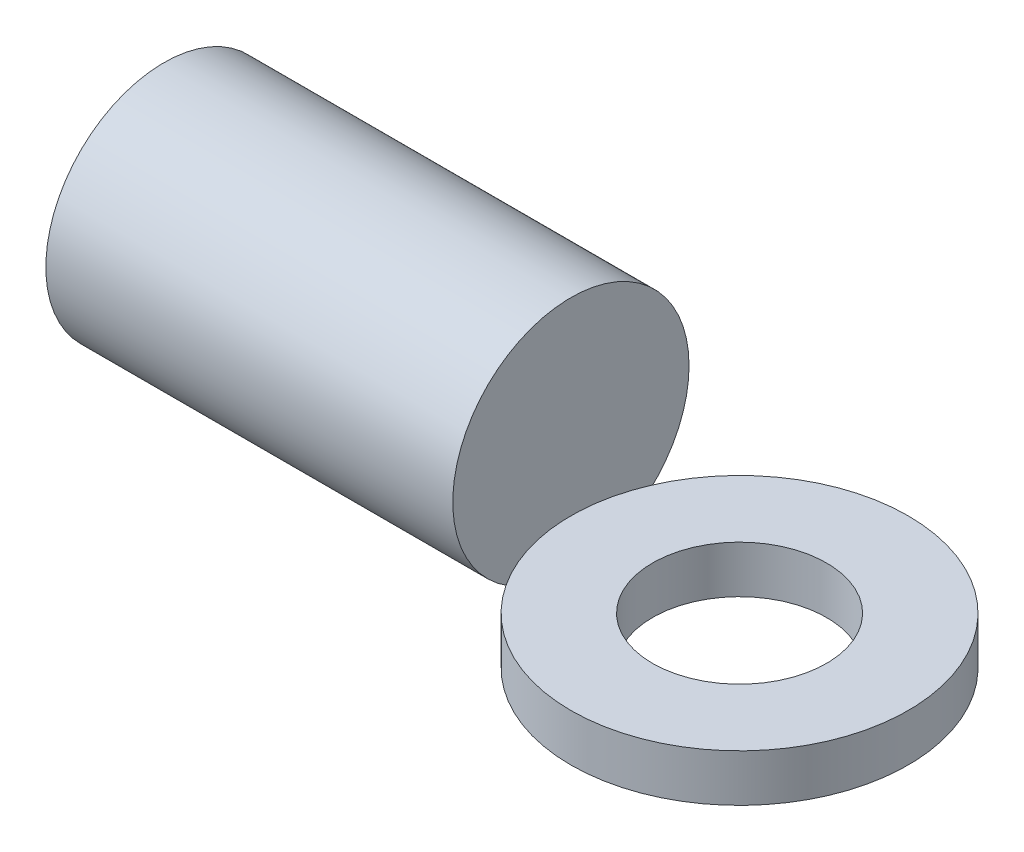
ISO-10303-21;
HEADER;
FILE_DESCRIPTION(('STEP AP214'),'2;1');
FILE_NAME('part.step','',(''),(''),'','','');
FILE_SCHEMA(('AUTOMOTIVE_DESIGN { 1 0 10303 214 1 1 1 1 }'));
ENDSEC;
DATA;
#1=APPLICATION_CONTEXT('core data for automotive mechanical design processes');
#2=APPLICATION_PROTOCOL_DEFINITION('international standard','automotive_design',2000,#1);
#3=PRODUCT_CONTEXT('',#1,'mechanical');
#4=PRODUCT('Part','Part','',(#3));
#5=PRODUCT_RELATED_PRODUCT_CATEGORY('part','',(#4));
#6=PRODUCT_DEFINITION_FORMATION('','',#4);
#7=PRODUCT_DEFINITION_CONTEXT('part definition',#1,'design');
#8=PRODUCT_DEFINITION('design','',#6,#7);
#9=PRODUCT_DEFINITION_SHAPE('','',#8);
#10=(LENGTH_UNIT() NAMED_UNIT(*) SI_UNIT(.MILLI.,.METRE.));
#11=(NAMED_UNIT(*) PLANE_ANGLE_UNIT() SI_UNIT($,.RADIAN.));
#12=(NAMED_UNIT(*) SI_UNIT($,.STERADIAN.) SOLID_ANGLE_UNIT());
#13=UNCERTAINTY_MEASURE_WITH_UNIT(LENGTH_MEASURE(1.E-05),#10,'distance_accuracy_value','');
#14=(GEOMETRIC_REPRESENTATION_CONTEXT(3) GLOBAL_UNCERTAINTY_ASSIGNED_CONTEXT((#13)) GLOBAL_UNIT_ASSIGNED_CONTEXT((#10,
#11,#12)) REPRESENTATION_CONTEXT('',''));
#15=CARTESIAN_POINT('',(0.,0.,0.));
#16=DIRECTION('',(0.,0.,1.));
#17=DIRECTION('',(1.,0.,0.));
#18=AXIS2_PLACEMENT_3D('',#15,#16,#17);
#19=CARTESIAN_POINT('',(0.,1.,0.));
#20=DIRECTION('',(0.,1.,0.));
#21=DIRECTION('',(0.,0.,1.));
#22=AXIS2_PLACEMENT_3D('',#19,#20,#21);
#23=PLANE('',#22);
#24=CARTESIAN_POINT('',(0.,1.,0.));
#25=DIRECTION('',(0.,1.,0.));
#26=DIRECTION('',(0.,0.,1.));
#27=AXIS2_PLACEMENT_3D('',#24,#25,#26);
#28=CIRCLE('',#27,3.5687);
#29=CARTESIAN_POINT('',(0.,1.,3.5687));
#30=VERTEX_POINT('',#29);
#31=EDGE_CURVE('E11',#30,#30,#28,.T.);
#32=ORIENTED_EDGE('',*,*,#31,.T.);
#33=EDGE_LOOP('',(#32));
#34=FACE_BOUND('',#33,.T.);
#35=CARTESIAN_POINT('',(0.,1.,0.));
#36=DIRECTION('',(0.,1.,0.));
#37=DIRECTION('',(0.,0.,1.));
#38=AXIS2_PLACEMENT_3D('',#35,#36,#37);
#39=CIRCLE('',#38,1.8415);
#40=CARTESIAN_POINT('',(0.,1.,1.8415));
#41=VERTEX_POINT('',#40);
#42=EDGE_CURVE('E50',#41,#41,#39,.T.);
#43=ORIENTED_EDGE('',*,*,#42,.F.);
#44=EDGE_LOOP('',(#43));
#45=FACE_BOUND('',#44,.T.);
#46=ADVANCED_FACE('F39',(#34,#45),#23,.T.);
#47=CARTESIAN_POINT('',(0.,0.,0.));
#48=DIRECTION('',(0.,1.,0.));
#49=DIRECTION('',(0.,0.,1.));
#50=AXIS2_PLACEMENT_3D('',#47,#48,#49);
#51=PLANE('',#50);
#52=CARTESIAN_POINT('',(0.,0.,0.));
#53=DIRECTION('',(0.,1.,0.));
#54=DIRECTION('',(0.,0.,1.));
#55=AXIS2_PLACEMENT_3D('',#52,#53,#54);
#56=CIRCLE('',#55,3.5687);
#57=CARTESIAN_POINT('',(0.,0.,3.5687));
#58=VERTEX_POINT('',#57);
#59=EDGE_CURVE('E43',#58,#58,#56,.T.);
#60=ORIENTED_EDGE('',*,*,#59,.F.);
#61=EDGE_LOOP('',(#60));
#62=FACE_BOUND('',#61,.T.);
#63=CARTESIAN_POINT('',(0.,0.,0.));
#64=DIRECTION('',(0.,1.,0.));
#65=DIRECTION('',(0.,0.,1.));
#66=AXIS2_PLACEMENT_3D('',#63,#64,#65);
#67=CIRCLE('',#66,1.8415);
#68=CARTESIAN_POINT('',(0.,0.,1.8415));
#69=VERTEX_POINT('',#68);
#70=EDGE_CURVE('E52',#69,#69,#67,.T.);
#71=ORIENTED_EDGE('',*,*,#70,.T.);
#72=EDGE_LOOP('',(#71));
#73=FACE_BOUND('',#72,.T.);
#74=ADVANCED_FACE('F62',(#62,#73),#51,.F.);
#75=CARTESIAN_POINT('',(0.,1.,0.));
#76=DIRECTION('',(0.,-1.,0.));
#77=DIRECTION('',(0.,0.,-1.));
#78=AXIS2_PLACEMENT_3D('',#75,#76,#77);
#79=CYLINDRICAL_SURFACE('',#78,3.5687);
#80=ORIENTED_EDGE('',*,*,#59,.T.);
#81=EDGE_LOOP('',(#80));
#82=FACE_BOUND('',#81,.T.);
#83=ORIENTED_EDGE('',*,*,#31,.F.);
#84=EDGE_LOOP('',(#83));
#85=FACE_BOUND('',#84,.T.);
#86=ADVANCED_FACE('F41',(#82,#85),#79,.T.);
#87=CARTESIAN_POINT('',(0.,1.,0.));
#88=DIRECTION('',(0.,-1.,0.));
#89=DIRECTION('',(0.,0.,-1.));
#90=AXIS2_PLACEMENT_3D('',#87,#88,#89);
#91=CYLINDRICAL_SURFACE('',#90,1.8415);
#92=ORIENTED_EDGE('',*,*,#42,.T.);
#93=EDGE_LOOP('',(#92));
#94=FACE_BOUND('',#93,.T.);
#95=ORIENTED_EDGE('',*,*,#70,.F.);
#96=EDGE_LOOP('',(#95));
#97=FACE_BOUND('',#96,.T.);
#98=ADVANCED_FACE('F58',(#94,#97),#91,.F.);
#99=CLOSED_SHELL('',(#46,#74,#86,#98));
#100=MANIFOLD_SOLID_BREP('B2',#99);
#101=CARTESIAN_POINT('',(3.50236781186548,2.5,0.));
#102=DIRECTION('',(-1.,0.,0.));
#103=DIRECTION('',(0.,0.,1.));
#104=AXIS2_PLACEMENT_3D('',#101,#102,#103);
#105=CYLINDRICAL_SURFACE('',#104,2.5);
#106=CARTESIAN_POINT('',(-12.18,2.5,0.));
#107=DIRECTION('',(1.,0.,0.));
#108=DIRECTION('',(0.,0.,-1.));
#109=AXIS2_PLACEMENT_3D('',#106,#107,#108);
#110=CIRCLE('',#109,2.5);
#111=CARTESIAN_POINT('',(-12.18,2.5,-2.5));
#112=VERTEX_POINT('',#111);
#113=EDGE_CURVE('E111',#112,#112,#110,.T.);
#114=ORIENTED_EDGE('',*,*,#113,.T.);
#115=EDGE_LOOP('',(#114));
#116=FACE_BOUND('',#115,.T.);
#117=CARTESIAN_POINT('',(-3.5687,2.5,0.));
#118=DIRECTION('',(1.,0.,0.));
#119=DIRECTION('',(0.,0.,-1.));
#120=AXIS2_PLACEMENT_3D('',#117,#118,#119);
#121=CIRCLE('',#120,2.5);
#122=CARTESIAN_POINT('',(-3.5687,2.5,-2.5));
#123=VERTEX_POINT('',#122);
#124=EDGE_CURVE('E38',#123,#123,#121,.T.);
#125=ORIENTED_EDGE('',*,*,#124,.F.);
#126=EDGE_LOOP('',(#125));
#127=FACE_BOUND('',#126,.T.);
#128=ADVANCED_FACE('F104',(#116,#127),#105,.T.);
#129=CARTESIAN_POINT('',(-12.18,2.5,0.));
#130=DIRECTION('',(1.,0.,0.));
#131=DIRECTION('',(0.,0.,-1.));
#132=AXIS2_PLACEMENT_3D('',#129,#130,#131);
#133=PLANE('',#132);
#134=ORIENTED_EDGE('',*,*,#113,.F.);
#135=EDGE_LOOP('',(#134));
#136=FACE_BOUND('',#135,.T.);
#137=ADVANCED_FACE('F119',(#136),#133,.F.);
#138=CARTESIAN_POINT('',(-3.5687,0.,0.));
#139=DIRECTION('',(1.,0.,0.));
#140=DIRECTION('',(0.,0.,-1.));
#141=AXIS2_PLACEMENT_3D('',#138,#139,#140);
#142=PLANE('',#141);
#143=ORIENTED_EDGE('',*,*,#124,.T.);
#144=EDGE_LOOP('',(#143));
#145=FACE_BOUND('',#144,.T.);
#146=ADVANCED_FACE('F106',(#145),#142,.T.);
#147=CLOSED_SHELL('',(#128,#137,#146));
#148=MANIFOLD_SOLID_BREP('B6',#147);
#149=ADVANCED_BREP_SHAPE_REPRESENTATION('',(#18,#100,#148),#14);
#150=SHAPE_DEFINITION_REPRESENTATION(#9,#149);
ENDSEC;
END-ISO-10303-21;
